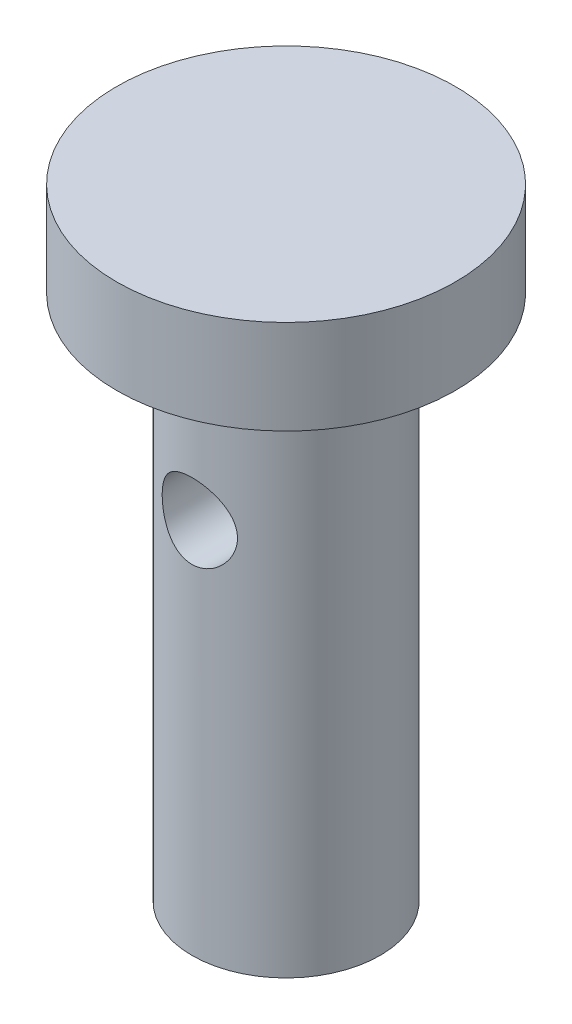
ISO-10303-21;
HEADER;
FILE_DESCRIPTION(('STEP AP214'),'2;1');
FILE_NAME('part.step','',(''),(''),'','','');
FILE_SCHEMA(('AUTOMOTIVE_DESIGN { 1 0 10303 214 1 1 1 1 }'));
ENDSEC;
DATA;
#1=APPLICATION_CONTEXT('core data for automotive mechanical design processes');
#2=APPLICATION_PROTOCOL_DEFINITION('international standard','automotive_design',2000,#1);
#3=PRODUCT_CONTEXT('',#1,'mechanical');
#4=PRODUCT('Part','Part','',(#3));
#5=PRODUCT_RELATED_PRODUCT_CATEGORY('part','',(#4));
#6=PRODUCT_DEFINITION_FORMATION('','',#4);
#7=PRODUCT_DEFINITION_CONTEXT('part definition',#1,'design');
#8=PRODUCT_DEFINITION('design','',#6,#7);
#9=PRODUCT_DEFINITION_SHAPE('','',#8);
#10=(LENGTH_UNIT() NAMED_UNIT(*) SI_UNIT(.MILLI.,.METRE.));
#11=(NAMED_UNIT(*) PLANE_ANGLE_UNIT() SI_UNIT($,.RADIAN.));
#12=(NAMED_UNIT(*) SI_UNIT($,.STERADIAN.) SOLID_ANGLE_UNIT());
#13=UNCERTAINTY_MEASURE_WITH_UNIT(LENGTH_MEASURE(1.E-05),#10,'distance_accuracy_value','');
#14=(GEOMETRIC_REPRESENTATION_CONTEXT(3) GLOBAL_UNCERTAINTY_ASSIGNED_CONTEXT((#13)) GLOBAL_UNIT_ASSIGNED_CONTEXT((#10,
#11,#12)) REPRESENTATION_CONTEXT('',''));
#15=CARTESIAN_POINT('',(0.,0.,0.));
#16=DIRECTION('',(0.,0.,1.));
#17=DIRECTION('',(1.,0.,0.));
#18=AXIS2_PLACEMENT_3D('',#15,#16,#17);
#19=CARTESIAN_POINT('',(0.,14.,0.));
#20=DIRECTION('',(0.,-1.,0.));
#21=DIRECTION('',(0.,0.,-1.));
#22=AXIS2_PLACEMENT_3D('',#19,#20,#21);
#23=CYLINDRICAL_SURFACE('',#22,2.5);
#24=CARTESIAN_POINT('',(0.,11.,-2.5));
#25=CARTESIAN_POINT('',(-0.0537465027214457,10.9999950740881,-2.49999635613542));
#26=CARTESIAN_POINT('',(-0.107586282045337,10.9956411239558,-2.49824647153466));
#27=CARTESIAN_POINT('',(-0.213748240208948,10.9783761482394,-2.49141726550321));
#28=CARTESIAN_POINT('',(-0.266065888780624,10.9654418604569,-2.48632889349439));
#29=CARTESIAN_POINT('',(-0.367476961363702,10.9315619609706,-2.47337104606559));
#30=CARTESIAN_POINT('',(-0.41658033080848,10.9106425768916,-2.46551068182036));
#31=CARTESIAN_POINT('',(-0.510535985164184,10.8614904133367,-2.44778305398039));
#32=CARTESIAN_POINT('',(-0.555389738375496,10.8332601725405,-2.43791648729028));
#33=CARTESIAN_POINT('',(-0.641750503785197,10.7688822507195,-2.41665443085209));
#34=CARTESIAN_POINT('',(-0.683031136275106,10.7324466718799,-2.40521148464595));
#35=CARTESIAN_POINT('',(-0.759087502392361,10.6532999982616,-2.38230288453097));
#36=CARTESIAN_POINT('',(-0.793860053566766,10.6105858513941,-2.37083722226896));
#37=CARTESIAN_POINT('',(-0.857437283646439,10.5177859648789,-2.34861395898568));
#38=CARTESIAN_POINT('',(-0.885907490597736,10.4674567569884,-2.33791057982476));
#39=CARTESIAN_POINT('',(-0.933877359518574,10.36223180079,-2.31916823593396));
#40=CARTESIAN_POINT('',(-0.953381282142917,10.3073382360758,-2.31112800622088));
#41=CARTESIAN_POINT('',(-0.981949411697934,10.197143833204,-2.29913178830409));
#42=CARTESIAN_POINT('',(-0.991446982902824,10.1419743822119,-2.29500710177802));
#43=CARTESIAN_POINT('',(-1.00108648082001,10.0306825008464,-2.29082002024572));
#44=CARTESIAN_POINT('',(-1.00123300815661,9.97456055268749,-2.29075562761384));
#45=CARTESIAN_POINT('',(-0.992494683752272,9.86712166427098,-2.29455250139997));
#46=CARTESIAN_POINT('',(-0.984237657152568,9.81574214279549,-2.29814087519225));
#47=CARTESIAN_POINT('',(-0.95997344014891,9.71517022199664,-2.30838093803918));
#48=CARTESIAN_POINT('',(-0.943964897402316,9.66597820594485,-2.31503316160836));
#49=CARTESIAN_POINT('',(-0.904347366275536,9.56999108190198,-2.33079742544265));
#50=CARTESIAN_POINT('',(-0.880589931157658,9.52326538047266,-2.33995689640394));
#51=CARTESIAN_POINT('',(-0.826253230366106,9.43429209181922,-2.35969058194945));
#52=CARTESIAN_POINT('',(-0.795671402550421,9.3920461952986,-2.37026532728424));
#53=CARTESIAN_POINT('',(-0.725775299727216,9.309795135599,-2.39263368371135));
#54=CARTESIAN_POINT('',(-0.685968731485317,9.27021563527699,-2.40445832488076));
#55=CARTESIAN_POINT('',(-0.600157213715095,9.19815776099898,-2.42729912479141));
#56=CARTESIAN_POINT('',(-0.554151032667216,9.16568080129485,-2.43831512222662));
#57=CARTESIAN_POINT('',(-0.45603882630292,9.10819127629208,-2.45857340632274));
#58=CARTESIAN_POINT('',(-0.403830245673238,9.08333885940147,-2.46777635047707));
#59=CARTESIAN_POINT('',(-0.29551188274144,9.04291606946097,-2.48307414164379));
#60=CARTESIAN_POINT('',(-0.239404098424836,9.0273409812213,-2.48917056731191));
#61=CARTESIAN_POINT('',(-0.128447943803909,9.00677585229015,-2.49728069753455));
#62=CARTESIAN_POINT('',(-0.0737216469927661,9.00121377287322,-2.49951472916757));
#63=CARTESIAN_POINT('',(0.0359226549039098,8.99914344973569,-2.50034239255315));
#64=CARTESIAN_POINT('',(0.090840606611963,9.00263285922625,-2.49893696791146));
#65=CARTESIAN_POINT('',(0.196716369560995,9.018145876276,-2.49278783531877));
#66=CARTESIAN_POINT('',(0.247741245887738,9.02977899017549,-2.48819695672762));
#67=CARTESIAN_POINT('',(0.347067714030391,9.06071785415491,-2.4762972070275));
#68=CARTESIAN_POINT('',(0.395368955112423,9.08002458983434,-2.46898798678265));
#69=CARTESIAN_POINT('',(0.489539392908352,9.12639246983998,-2.45208297385406));
#70=CARTESIAN_POINT('',(0.535289011377704,9.15367273602157,-2.44242407989902));
#71=CARTESIAN_POINT('',(0.621721795623279,9.21497016195282,-2.42186682372762));
#72=CARTESIAN_POINT('',(0.662402920380564,9.24899002146131,-2.41096796555135));
#73=CARTESIAN_POINT('',(0.740361521514411,9.32543500647482,-2.38822558819056));
#74=CARTESIAN_POINT('',(0.777236966903034,9.36826677075311,-2.37636720712526));
#75=CARTESIAN_POINT('',(0.843375598706857,9.45972004150469,-2.35370836458566));
#76=CARTESIAN_POINT('',(0.872637530668756,9.50834250016998,-2.34290807763255));
#77=CARTESIAN_POINT('',(0.922903750965815,9.61073084729705,-2.32357149953854));
#78=CARTESIAN_POINT('',(0.943825297267228,9.66454199960616,-2.31505815442394));
#79=CARTESIAN_POINT('',(0.976148109852653,9.77536682585758,-2.30161836738966));
#80=CARTESIAN_POINT('',(0.987556402634659,9.83237810290621,-2.29668927847999));
#81=CARTESIAN_POINT('',(0.999857808639202,9.94356395088727,-2.29135879649963));
#82=CARTESIAN_POINT('',(1.00144854115143,9.99764741979668,-2.29065710504086));
#83=CARTESIAN_POINT('',(0.995901579638763,10.1052724288566,-2.29307418016549));
#84=CARTESIAN_POINT('',(0.988764993956892,10.1588140369513,-2.29619246162397));
#85=CARTESIAN_POINT('',(0.966535683076825,10.2616660949275,-2.3056332453951));
#86=CARTESIAN_POINT('',(0.95176874678549,10.3110601372165,-2.31182415913725));
#87=CARTESIAN_POINT('',(0.915002724245507,10.4066893148067,-2.32662000616348));
#88=CARTESIAN_POINT('',(0.893001640696907,10.4529235734499,-2.33522560603003));
#89=CARTESIAN_POINT('',(0.840936381379866,10.5438048096354,-2.35449304802246));
#90=CARTESIAN_POINT('',(0.810482667579746,10.5882093350652,-2.36524441156621));
#91=CARTESIAN_POINT('',(0.742946059635749,10.6714966586019,-2.38731902186119));
#92=CARTESIAN_POINT('',(0.705861167409062,10.7103777860642,-2.39864244024203));
#93=CARTESIAN_POINT('',(0.623252753136233,10.7841014266318,-2.42146783543697));
#94=CARTESIAN_POINT('',(0.57733800057307,10.818518653449,-2.43293378981093));
#95=CARTESIAN_POINT('',(0.479950160142891,10.8791685213108,-2.45400203356858));
#96=CARTESIAN_POINT('',(0.428474502273621,10.9053973560763,-2.46360345546453));
#97=CARTESIAN_POINT('',(0.322369031247603,10.9483111075951,-2.47969857407931));
#98=CARTESIAN_POINT('',(0.267815809109849,10.9651646617802,-2.48624681527514));
#99=CARTESIAN_POINT('',(0.156438273140612,10.9893195604771,-2.49572153104683));
#100=CARTESIAN_POINT('',(0.0996217629294575,10.996651218372,-2.49865949747819));
#101=CARTESIAN_POINT('',(0.0284561489454656,10.9996976904891,-2.49987949752068));
#102=CARTESIAN_POINT('',(0.0142313443703796,11.0000013043146,-2.50000096484588));
#103=CARTESIAN_POINT('',(0.,11.,-2.5));
#104=B_SPLINE_CURVE_WITH_KNOTS('',3,(#24,#25,#26,#27,#28,#29,#30,#31,#32,#33,#34,#35,#36,#37,
#38,#39,#40,#41,#42,#43,#44,#45,#46,#47,#48,#49,#50,#51,#52,#53,#54,#55,#56,#57,#58,#59,#60,#61,
#62,#63,#64,#65,#66,#67,#68,#69,#70,#71,#72,#73,#74,#75,#76,#77,#78,#79,#80,#81,#82,#83,#84,#85,
#86,#87,#88,#89,#90,#91,#92,#93,#94,#95,#96,#97,#98,#99,#100,#101,#102,#103),.UNSPECIFIED.,.T.,
.F.,(4,2,2,2,2,2,2,2,2,2,2,2,2,2,2,2,2,2,2,2,2,2,2,2,2,2,2,2,2,2,2,2,2,2,2,2,2,2,2,4),(0.,
0.161201493946536,0.322841818003967,0.483955728735791,0.645013767839922,0.812986908501985,
0.981041974672056,1.15657629409608,1.33202711559134,1.49952052654414,1.66693153170244,
1.82269164200686,1.97847893628024,2.13744563149408,2.29647210969092,2.46779174593278,
2.63914546419867,2.81388456581403,2.98853478056895,3.15284592264004,3.31711446785041,
3.47400227782183,3.63091024496898,3.79261756699132,3.95438979749485,4.12684237312207,
4.29932334521874,4.47347522570414,4.64749836322967,4.80899836696374,4.97047786281523,
5.12557159274385,5.28070817902581,5.44472734028346,5.60879600674197,5.78350211766918,
5.95828931820267,6.1298215050666,6.30080626202171,6.34349022948398),.UNSPECIFIED.);
#105=CARTESIAN_POINT('',(0.,11.,-2.5));
#106=VERTEX_POINT('',#105);
#107=EDGE_CURVE('E45',#106,#106,#104,.T.);
#108=ORIENTED_EDGE('',*,*,#107,.T.);
#109=EDGE_LOOP('',(#108));
#110=FACE_BOUND('',#109,.T.);
#111=CARTESIAN_POINT('',(1.,10.,2.29128784747792));
#112=CARTESIAN_POINT('',(0.999994127101895,9.94643025095006,2.29129325828211));
#113=CARTESIAN_POINT('',(0.995669909297177,9.89278473264765,2.29319301242133));
#114=CARTESIAN_POINT('',(0.978534515296367,9.78703258356147,2.30055457093922));
#115=CARTESIAN_POINT('',(0.965701652221067,9.73493024145976,2.30602547693426));
#116=CARTESIAN_POINT('',(0.932117516284353,9.63397352901498,2.31980227895648));
#117=CARTESIAN_POINT('',(0.911396076262713,9.58510772631987,2.32809748178557));
#118=CARTESIAN_POINT('',(0.862710134685806,9.49155747457019,2.3465733254764));
#119=CARTESIAN_POINT('',(0.834747214633751,9.44687211542457,2.35675355451961));
#120=CARTESIAN_POINT('',(0.770660987293711,9.36036979887927,2.37850432525516));
#121=CARTESIAN_POINT('',(0.734189678863666,9.31882178853527,2.39011958979373));
#122=CARTESIAN_POINT('',(0.654854552887024,9.24223550134231,2.41306228489405));
#123=CARTESIAN_POINT('',(0.611988510837842,9.20719949935507,2.42438961368186));
#124=CARTESIAN_POINT('',(0.51900315517819,9.14329680150865,2.44601703953427));
#125=CARTESIAN_POINT('',(0.468664482806142,9.11472784926468,2.45625901841784));
#126=CARTESIAN_POINT('',(0.363412661437561,9.0665782158051,2.47401963815773));
#127=CARTESIAN_POINT('',(0.308501384643982,9.04699387710903,2.48153938692337));
#128=CARTESIAN_POINT('',(0.198483213419448,9.0183292567813,2.49269162504142));
#129=CARTESIAN_POINT('',(0.143514492402304,9.00878634295549,2.49649468387678));
#130=CARTESIAN_POINT('',(0.0326331643188271,8.99898575716866,2.50040155341352));
#131=CARTESIAN_POINT('',(-0.0232790829126999,8.99872462203258,2.50050674384656));
#132=CARTESIAN_POINT('',(-0.131116247357655,9.00724138488749,2.49710981410893));
#133=CARTESIAN_POINT('',(-0.183088726437016,9.01551238637347,2.49380998385918));
#134=CARTESIAN_POINT('',(-0.284836554609168,9.03999643815538,2.48424645734395));
#135=CARTESIAN_POINT('',(-0.334611742195078,9.0562100712002,2.47798254360556));
#136=CARTESIAN_POINT('',(-0.431448969255827,9.09631824143815,2.4629841222885));
#137=CARTESIAN_POINT('',(-0.478458811689816,9.12032485740777,2.454213802334));
#138=CARTESIAN_POINT('',(-0.567904075370287,9.1752325034595,2.43507292589849));
#139=CARTESIAN_POINT('',(-0.610337921358054,9.20613589654881,2.42470182132537));
#140=CARTESIAN_POINT('',(-0.692384413996075,9.2763245679733,2.40260818589167));
#141=CARTESIAN_POINT('',(-0.73162892263682,9.31602694629192,2.3908416326012));
#142=CARTESIAN_POINT('',(-0.803053707692662,9.40149528591048,2.36780830482389));
#143=CARTESIAN_POINT('',(-0.835231671879828,9.44726322407708,2.35654169488174));
#144=CARTESIAN_POINT('',(-0.892452094371466,9.54520951120448,2.33548448720906));
#145=CARTESIAN_POINT('',(-0.917267325867452,9.59753241524191,2.3257445709069));
#146=CARTESIAN_POINT('',(-0.957588129983133,9.70610774523101,2.30943795233662));
#147=CARTESIAN_POINT('',(-0.973099749202199,9.76235759238542,2.3028691896167));
#148=CARTESIAN_POINT('',(-0.993477474415979,9.87351788871803,2.29414879836282));
#149=CARTESIAN_POINT('',(-0.998936048404205,9.92830022356008,2.29175183224038));
#150=CARTESIAN_POINT('',(-1.00078066322451,10.038038603884,2.29094748938549));
#151=CARTESIAN_POINT('',(-0.997169455296442,10.0929945916389,2.29253890281232));
#152=CARTESIAN_POINT('',(-0.981516447394262,10.1982294674774,2.29928022178566));
#153=CARTESIAN_POINT('',(-0.969966531011728,10.2485964686998,2.30422228898885));
#154=CARTESIAN_POINT('',(-0.939402093455639,10.346644202393,2.31685025513936));
#155=CARTESIAN_POINT('',(-0.920385917151196,10.3943243365537,2.32453676244372));
#156=CARTESIAN_POINT('',(-0.874567819740727,10.4878011788977,2.34216890929975));
#157=CARTESIAN_POINT('',(-0.847481434132298,10.5334430943472,2.35219352319567));
#158=CARTESIAN_POINT('',(-0.786582612220938,10.6197414937208,2.37325192578919));
#159=CARTESIAN_POINT('',(-0.752767436740992,10.6603959363978,2.38428612448031));
#160=CARTESIAN_POINT('',(-0.676422105840242,10.7386867042996,2.40710457985699));
#161=CARTESIAN_POINT('',(-0.63343271472255,10.7758782826455,2.41888403642601));
#162=CARTESIAN_POINT('',(-0.541541816684422,10.8425885383052,2.44109897283781));
#163=CARTESIAN_POINT('',(-0.492640069233932,10.8721069032986,2.4515343979662));
#164=CARTESIAN_POINT('',(-0.390139967000881,10.9225238132306,2.46991857950143));
#165=CARTESIAN_POINT('',(-0.336542740497033,10.9434244220829,2.47786793120137));
#166=CARTESIAN_POINT('',(-0.226196795459613,10.9757744262038,2.49036356734645));
#167=CARTESIAN_POINT('',(-0.169449805147135,10.98722895072,2.49491169853772));
#168=CARTESIAN_POINT('',(-0.0584082551731522,10.9997523508127,2.49989504105256));
#169=CARTESIAN_POINT('',(-0.00419524629652834,11.0014500642313,2.50057923372437));
#170=CARTESIAN_POINT('',(0.103716917866621,10.996072260358,2.49843021189296));
#171=CARTESIAN_POINT('',(0.157416149697311,10.9889980711072,2.49559752983456));
#172=CARTESIAN_POINT('',(0.261085450973205,10.9667266058208,2.48685756682127));
#173=CARTESIAN_POINT('',(0.311119402324192,10.9517855269622,2.48104740317165));
#174=CARTESIAN_POINT('',(0.40796117737947,10.9144735977191,2.46697473916019));
#175=CARTESIAN_POINT('',(0.454768404133638,10.8921013769898,2.45871178652006));
#176=CARTESIAN_POINT('',(0.546101520928058,10.8394484007553,2.44009047180029));
#177=CARTESIAN_POINT('',(0.590435193403213,10.8088618525575,2.42965564864115));
#178=CARTESIAN_POINT('',(0.673527014262037,10.7411057404105,2.40794701593224));
#179=CARTESIAN_POINT('',(0.712282842872879,10.7039334517699,2.3966728602525));
#180=CARTESIAN_POINT('',(0.785600632542996,10.6213423877375,2.37368881779711));
#181=CARTESIAN_POINT('',(0.819754443599514,10.5755555632994,2.36199516302692));
#182=CARTESIAN_POINT('',(0.879923725219699,10.4785289312856,2.3402483573759));
#183=CARTESIAN_POINT('',(0.905938238949995,10.4272884835451,2.33019539943728));
#184=CARTESIAN_POINT('',(0.946995543836656,10.325481399076,2.31379432228954));
#185=CARTESIAN_POINT('',(0.962813757082105,10.2752673826244,2.30719459305824));
#186=CARTESIAN_POINT('',(0.986358878909194,10.1727572901848,2.29723001801982));
#187=CARTESIAN_POINT('',(0.994108333944009,10.1204674420165,2.29385616036088));
#188=CARTESIAN_POINT('',(0.999232129155088,10.045311218831,2.29162229378817));
#189=CARTESIAN_POINT('',(1.00000248449744,10.0226623895012,2.29128555846679));
#190=CARTESIAN_POINT('',(1.,10.,2.29128784747792));
#191=B_SPLINE_CURVE_WITH_KNOTS('',3,(#111,#112,#113,#114,#115,#116,#117,#118,#119,#120,#121,
#122,#123,#124,#125,#126,#127,#128,#129,#130,#131,#132,#133,#134,#135,#136,#137,#138,#139,#140,
#141,#142,#143,#144,#145,#146,#147,#148,#149,#150,#151,#152,#153,#154,#155,#156,#157,#158,#159,
#160,#161,#162,#163,#164,#165,#166,#167,#168,#169,#170,#171,#172,#173,#174,#175,#176,#177,#178,
#179,#180,#181,#182,#183,#184,#185,#186,#187,#188,#189,#190),.UNSPECIFIED.,.T.,.F.,(4,2,2,2,2,2,
2,2,2,2,2,2,2,2,2,2,2,2,2,2,2,2,2,2,2,2,2,2,2,2,2,2,2,2,2,2,2,2,2,4),(0.,0.160638824383825,
0.321688667911123,0.482135411646697,0.642547144119308,0.811278091422123,0.980067871741711,
1.15551334545714,1.3308873348474,1.49777091443592,1.66459222652836,1.82204322415151,
1.9795057756453,2.13934150117449,2.29923207470016,2.46962022040678,2.64006403563564,
2.81532229357288,2.99046652397056,3.15491073759215,3.31930507450975,3.47433624039578,
3.62940179322824,3.79075577323356,3.9521755725993,4.12551867120495,4.29886882423379,
4.47217743653411,4.64539187974073,4.80730519874982,4.96919400753306,5.12610997218681,
5.28305488911298,5.44693525566968,5.61088358279108,5.78498126639812,5.959099408766,
6.11758330406544,6.27562315106628,6.34358052760367),.UNSPECIFIED.);
#192=CARTESIAN_POINT('',(1.,10.,2.29128784747792));
#193=VERTEX_POINT('',#192);
#194=EDGE_CURVE('E65',#193,#193,#191,.T.);
#195=ORIENTED_EDGE('',*,*,#194,.T.);
#196=EDGE_LOOP('',(#195));
#197=FACE_BOUND('',#196,.T.);
#198=CARTESIAN_POINT('',(0.,14.,0.));
#199=DIRECTION('',(0.,1.,0.));
#200=DIRECTION('',(0.,0.,1.));
#201=AXIS2_PLACEMENT_3D('',#198,#199,#200);
#202=CIRCLE('',#201,2.5);
#203=CARTESIAN_POINT('',(0.,14.,2.5));
#204=VERTEX_POINT('',#203);
#205=EDGE_CURVE('E10',#204,#204,#202,.T.);
#206=ORIENTED_EDGE('',*,*,#205,.F.);
#207=EDGE_LOOP('',(#206));
#208=FACE_BOUND('',#207,.T.);
#209=CARTESIAN_POINT('',(0.,0.,0.));
#210=DIRECTION('',(0.,1.,0.));
#211=DIRECTION('',(0.,0.,1.));
#212=AXIS2_PLACEMENT_3D('',#209,#210,#211);
#213=CIRCLE('',#212,2.5);
#214=CARTESIAN_POINT('',(0.,0.,2.5));
#215=VERTEX_POINT('',#214);
#216=EDGE_CURVE('E54',#215,#215,#213,.T.);
#217=ORIENTED_EDGE('',*,*,#216,.T.);
#218=EDGE_LOOP('',(#217));
#219=FACE_BOUND('',#218,.T.);
#220=ADVANCED_FACE('F41',(#110,#197,#208,#219),#23,.T.);
#221=CARTESIAN_POINT('',(0.,0.,0.));
#222=DIRECTION('',(0.,1.,0.));
#223=DIRECTION('',(0.,0.,1.));
#224=AXIS2_PLACEMENT_3D('',#221,#222,#223);
#225=PLANE('',#224);
#226=ORIENTED_EDGE('',*,*,#216,.F.);
#227=EDGE_LOOP('',(#226));
#228=FACE_BOUND('',#227,.T.);
#229=ADVANCED_FACE('F86',(#228),#225,.F.);
#230=CARTESIAN_POINT('',(0.,16.5,0.));
#231=DIRECTION('',(0.,-1.,0.));
#232=DIRECTION('',(0.,0.,-1.));
#233=AXIS2_PLACEMENT_3D('',#230,#231,#232);
#234=CYLINDRICAL_SURFACE('',#233,4.5);
#235=CARTESIAN_POINT('',(0.,16.5,0.));
#236=DIRECTION('',(0.,1.,0.));
#237=DIRECTION('',(0.,0.,1.));
#238=AXIS2_PLACEMENT_3D('',#235,#236,#237);
#239=CIRCLE('',#238,4.5);
#240=CARTESIAN_POINT('',(0.,16.5,4.5));
#241=VERTEX_POINT('',#240);
#242=EDGE_CURVE('E60',#241,#241,#239,.T.);
#243=ORIENTED_EDGE('',*,*,#242,.F.);
#244=EDGE_LOOP('',(#243));
#245=FACE_BOUND('',#244,.T.);
#246=CARTESIAN_POINT('',(0.,14.,0.));
#247=DIRECTION('',(0.,1.,0.));
#248=DIRECTION('',(0.,0.,1.));
#249=AXIS2_PLACEMENT_3D('',#246,#247,#248);
#250=CIRCLE('',#249,4.5);
#251=CARTESIAN_POINT('',(0.,14.,4.5));
#252=VERTEX_POINT('',#251);
#253=EDGE_CURVE('E63',#252,#252,#250,.T.);
#254=ORIENTED_EDGE('',*,*,#253,.T.);
#255=EDGE_LOOP('',(#254));
#256=FACE_BOUND('',#255,.T.);
#257=ADVANCED_FACE('F81',(#245,#256),#234,.T.);
#258=CARTESIAN_POINT('',(0.,16.5,0.));
#259=DIRECTION('',(0.,1.,0.));
#260=DIRECTION('',(0.,0.,1.));
#261=AXIS2_PLACEMENT_3D('',#258,#259,#260);
#262=PLANE('',#261);
#263=ORIENTED_EDGE('',*,*,#242,.T.);
#264=EDGE_LOOP('',(#263));
#265=FACE_BOUND('',#264,.T.);
#266=ADVANCED_FACE('F77',(#265),#262,.T.);
#267=CARTESIAN_POINT('',(0.,14.,0.));
#268=DIRECTION('',(0.,1.,0.));
#269=DIRECTION('',(0.,0.,1.));
#270=AXIS2_PLACEMENT_3D('',#267,#268,#269);
#271=PLANE('',#270);
#272=ORIENTED_EDGE('',*,*,#205,.T.);
#273=EDGE_LOOP('',(#272));
#274=FACE_BOUND('',#273,.T.);
#275=ORIENTED_EDGE('',*,*,#253,.F.);
#276=EDGE_LOOP('',(#275));
#277=FACE_BOUND('',#276,.T.);
#278=ADVANCED_FACE('F75',(#274,#277),#271,.F.);
#279=CARTESIAN_POINT('',(0.,10.,-3.));
#280=DIRECTION('',(0.,0.,1.));
#281=DIRECTION('',(1.,0.,0.));
#282=AXIS2_PLACEMENT_3D('',#279,#280,#281);
#283=CYLINDRICAL_SURFACE('',#282,1.);
#284=ORIENTED_EDGE('',*,*,#194,.F.);
#285=EDGE_LOOP('',(#284));
#286=FACE_BOUND('',#285,.T.);
#287=ORIENTED_EDGE('',*,*,#107,.F.);
#288=EDGE_LOOP('',(#287));
#289=FACE_BOUND('',#288,.T.);
#290=ADVANCED_FACE('F71',(#286,#289),#283,.F.);
#291=CLOSED_SHELL('',(#220,#229,#257,#266,#278,#290));
#292=MANIFOLD_SOLID_BREP('B2',#291);
#293=ADVANCED_BREP_SHAPE_REPRESENTATION('',(#18,#292),#14);
#294=SHAPE_DEFINITION_REPRESENTATION(#9,#293);
ENDSEC;
END-ISO-10303-21;
